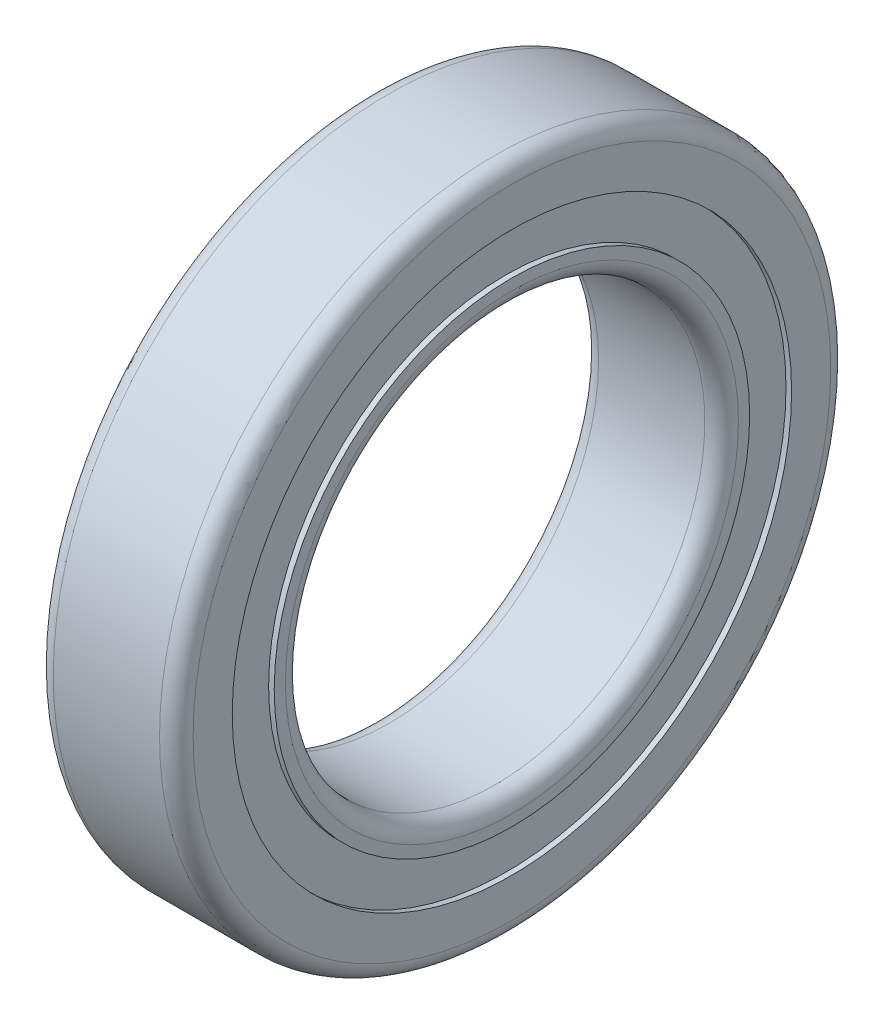
ISO-10303-21;
HEADER;
FILE_DESCRIPTION(('STEP AP214'),'2;1');
FILE_NAME('part.step','',(''),(''),'','','');
FILE_SCHEMA(('AUTOMOTIVE_DESIGN { 1 0 10303 214 1 1 1 1 }'));
ENDSEC;
DATA;
#1=APPLICATION_CONTEXT('core data for automotive mechanical design processes');
#2=APPLICATION_PROTOCOL_DEFINITION('international standard','automotive_design',2000,#1);
#3=PRODUCT_CONTEXT('',#1,'mechanical');
#4=PRODUCT('Part','Part','',(#3));
#5=PRODUCT_RELATED_PRODUCT_CATEGORY('part','',(#4));
#6=PRODUCT_DEFINITION_FORMATION('','',#4);
#7=PRODUCT_DEFINITION_CONTEXT('part definition',#1,'design');
#8=PRODUCT_DEFINITION('design','',#6,#7);
#9=PRODUCT_DEFINITION_SHAPE('','',#8);
#10=(LENGTH_UNIT() NAMED_UNIT(*) SI_UNIT(.MILLI.,.METRE.));
#11=(NAMED_UNIT(*) PLANE_ANGLE_UNIT() SI_UNIT($,.RADIAN.));
#12=(NAMED_UNIT(*) SI_UNIT($,.STERADIAN.) SOLID_ANGLE_UNIT());
#13=UNCERTAINTY_MEASURE_WITH_UNIT(LENGTH_MEASURE(1.E-05),#10,'distance_accuracy_value','');
#14=(GEOMETRIC_REPRESENTATION_CONTEXT(3) GLOBAL_UNCERTAINTY_ASSIGNED_CONTEXT((#13)) GLOBAL_UNIT_ASSIGNED_CONTEXT((#10,
#11,#12)) REPRESENTATION_CONTEXT('',''));
#15=CARTESIAN_POINT('',(0.,0.,0.));
#16=DIRECTION('',(0.,0.,1.));
#17=DIRECTION('',(1.,0.,0.));
#18=AXIS2_PLACEMENT_3D('',#15,#16,#17);
#19=CARTESIAN_POINT('',(0.,0.,0.));
#20=DIRECTION('',(-1.,0.,0.));
#21=DIRECTION('',(0.,0.,1.));
#22=AXIS2_PLACEMENT_3D('',#19,#20,#21);
#23=CYLINDRICAL_SURFACE('',#22,8.5);
#24=CARTESIAN_POINT('',(0.,0.,0.));
#25=DIRECTION('',(-1.,0.,0.));
#26=DIRECTION('',(0.,0.,1.));
#27=AXIS2_PLACEMENT_3D('',#24,#25,#26);
#28=CIRCLE('',#27,8.5);
#29=CARTESIAN_POINT('',(0.,0.,8.5));
#30=VERTEX_POINT('',#29);
#31=EDGE_CURVE('E63',#30,#30,#28,.T.);
#32=ORIENTED_EDGE('',*,*,#31,.F.);
#33=EDGE_LOOP('',(#32));
#34=FACE_BOUND('',#33,.T.);
#35=CARTESIAN_POINT('',(0.200000000000001,0.,0.));
#36=DIRECTION('',(-1.,0.,0.));
#37=DIRECTION('',(0.,0.,1.));
#38=AXIS2_PLACEMENT_3D('',#35,#36,#37);
#39=CIRCLE('',#38,8.5);
#40=CARTESIAN_POINT('',(0.200000000000001,0.,8.5));
#41=VERTEX_POINT('',#40);
#42=EDGE_CURVE('E84',#41,#41,#39,.T.);
#43=ORIENTED_EDGE('',*,*,#42,.T.);
#44=EDGE_LOOP('',(#43));
#45=FACE_BOUND('',#44,.T.);
#46=ADVANCED_FACE('F31',(#34,#45),#23,.T.);
#47=CARTESIAN_POINT('',(0.,8.5,0.));
#48=DIRECTION('',(1.,0.,0.));
#49=DIRECTION('',(0.,0.,-1.));
#50=AXIS2_PLACEMENT_3D('',#47,#48,#49);
#51=PLANE('',#50);
#52=CARTESIAN_POINT('',(0.,0.,0.));
#53=DIRECTION('',(1.,0.,0.));
#54=DIRECTION('',(0.,0.,-1.));
#55=AXIS2_PLACEMENT_3D('',#52,#53,#54);
#56=CIRCLE('',#55,8.1);
#57=CARTESIAN_POINT('',(0.,0.,-8.1));
#58=VERTEX_POINT('',#57);
#59=EDGE_CURVE('E54',#58,#58,#56,.T.);
#60=ORIENTED_EDGE('',*,*,#59,.T.);
#61=EDGE_LOOP('',(#60));
#62=FACE_BOUND('',#61,.T.);
#63=ORIENTED_EDGE('',*,*,#31,.T.);
#64=EDGE_LOOP('',(#63));
#65=FACE_BOUND('',#64,.T.);
#66=ADVANCED_FACE('F113',(#62,#65),#51,.F.);
#67=CARTESIAN_POINT('',(0.,0.,0.));
#68=DIRECTION('',(-1.,0.,0.));
#69=DIRECTION('',(0.,0.,1.));
#70=AXIS2_PLACEMENT_3D('',#67,#68,#69);
#71=CYLINDRICAL_SURFACE('',#70,7.5);
#72=CARTESIAN_POINT('',(0.6,0.,0.));
#73=DIRECTION('',(1.,0.,0.));
#74=DIRECTION('',(0.,0.,-1.));
#75=AXIS2_PLACEMENT_3D('',#72,#73,#74);
#76=CIRCLE('',#75,7.5);
#77=CARTESIAN_POINT('',(0.6,0.,-7.5));
#78=VERTEX_POINT('',#77);
#79=EDGE_CURVE('E57',#78,#78,#76,.F.);
#80=ORIENTED_EDGE('',*,*,#79,.T.);
#81=EDGE_LOOP('',(#80));
#82=FACE_BOUND('',#81,.T.);
#83=CARTESIAN_POINT('',(4.4,0.,0.));
#84=DIRECTION('',(-1.,0.,0.));
#85=DIRECTION('',(0.,0.,1.));
#86=AXIS2_PLACEMENT_3D('',#83,#84,#85);
#87=CIRCLE('',#86,7.5);
#88=CARTESIAN_POINT('',(4.4,0.,7.5));
#89=VERTEX_POINT('',#88);
#90=EDGE_CURVE('E60',#89,#89,#87,.F.);
#91=ORIENTED_EDGE('',*,*,#90,.T.);
#92=EDGE_LOOP('',(#91));
#93=FACE_BOUND('',#92,.T.);
#94=ADVANCED_FACE('F119',(#82,#93),#71,.F.);
#95=CARTESIAN_POINT('',(5.,7.5,0.));
#96=DIRECTION('',(-1.,0.,0.));
#97=DIRECTION('',(0.,0.,1.));
#98=AXIS2_PLACEMENT_3D('',#95,#96,#97);
#99=PLANE('',#98);
#100=CARTESIAN_POINT('',(5.,0.,0.));
#101=DIRECTION('',(-1.,0.,0.));
#102=DIRECTION('',(0.,0.,1.));
#103=AXIS2_PLACEMENT_3D('',#100,#101,#102);
#104=CIRCLE('',#103,8.1);
#105=CARTESIAN_POINT('',(5.,0.,8.1));
#106=VERTEX_POINT('',#105);
#107=EDGE_CURVE('E51',#106,#106,#104,.T.);
#108=ORIENTED_EDGE('',*,*,#107,.T.);
#109=EDGE_LOOP('',(#108));
#110=FACE_BOUND('',#109,.T.);
#111=CARTESIAN_POINT('',(5.,0.,0.));
#112=DIRECTION('',(-1.,0.,0.));
#113=DIRECTION('',(0.,0.,1.));
#114=AXIS2_PLACEMENT_3D('',#111,#112,#113);
#115=CIRCLE('',#114,8.5);
#116=CARTESIAN_POINT('',(5.,0.,8.5));
#117=VERTEX_POINT('',#116);
#118=EDGE_CURVE('E66',#117,#117,#115,.T.);
#119=ORIENTED_EDGE('',*,*,#118,.F.);
#120=EDGE_LOOP('',(#119));
#121=FACE_BOUND('',#120,.T.);
#122=ADVANCED_FACE('F189',(#110,#121),#99,.F.);
#123=CARTESIAN_POINT('',(0.,0.,0.));
#124=DIRECTION('',(-1.,0.,0.));
#125=DIRECTION('',(0.,0.,1.));
#126=AXIS2_PLACEMENT_3D('',#123,#124,#125);
#127=CYLINDRICAL_SURFACE('',#126,8.5);
#128=CARTESIAN_POINT('',(4.8,0.,0.));
#129=DIRECTION('',(-1.,0.,0.));
#130=DIRECTION('',(0.,0.,1.));
#131=AXIS2_PLACEMENT_3D('',#128,#129,#130);
#132=CIRCLE('',#131,8.5);
#133=CARTESIAN_POINT('',(4.8,0.,8.5));
#134=VERTEX_POINT('',#133);
#135=EDGE_CURVE('E69',#134,#134,#132,.T.);
#136=ORIENTED_EDGE('',*,*,#135,.F.);
#137=EDGE_LOOP('',(#136));
#138=FACE_BOUND('',#137,.T.);
#139=ORIENTED_EDGE('',*,*,#118,.T.);
#140=EDGE_LOOP('',(#139));
#141=FACE_BOUND('',#140,.T.);
#142=ADVANCED_FACE('F194',(#138,#141),#127,.T.);
#143=CARTESIAN_POINT('',(4.8,8.5,0.));
#144=DIRECTION('',(-1.,0.,0.));
#145=DIRECTION('',(0.,0.,1.));
#146=AXIS2_PLACEMENT_3D('',#143,#144,#145);
#147=PLANE('',#146);
#148=CARTESIAN_POINT('',(4.8,0.,0.));
#149=DIRECTION('',(-1.,0.,0.));
#150=DIRECTION('',(0.,0.,1.));
#151=AXIS2_PLACEMENT_3D('',#148,#149,#150);
#152=CIRCLE('',#151,10.);
#153=CARTESIAN_POINT('',(4.8,0.,10.));
#154=VERTEX_POINT('',#153);
#155=EDGE_CURVE('E72',#154,#154,#152,.T.);
#156=ORIENTED_EDGE('',*,*,#155,.F.);
#157=EDGE_LOOP('',(#156));
#158=FACE_BOUND('',#157,.T.);
#159=ORIENTED_EDGE('',*,*,#135,.T.);
#160=EDGE_LOOP('',(#159));
#161=FACE_BOUND('',#160,.T.);
#162=ADVANCED_FACE('F229',(#158,#161),#147,.F.);
#163=CARTESIAN_POINT('',(0.,0.,0.));
#164=DIRECTION('',(-1.,0.,0.));
#165=DIRECTION('',(0.,0.,1.));
#166=AXIS2_PLACEMENT_3D('',#163,#164,#165);
#167=CYLINDRICAL_SURFACE('',#166,10.);
#168=CARTESIAN_POINT('',(5.,0.,0.));
#169=DIRECTION('',(-1.,0.,0.));
#170=DIRECTION('',(0.,0.,1.));
#171=AXIS2_PLACEMENT_3D('',#168,#169,#170);
#172=CIRCLE('',#171,10.);
#173=CARTESIAN_POINT('',(5.,0.,10.));
#174=VERTEX_POINT('',#173);
#175=EDGE_CURVE('E75',#174,#174,#172,.T.);
#176=ORIENTED_EDGE('',*,*,#175,.F.);
#177=EDGE_LOOP('',(#176));
#178=FACE_BOUND('',#177,.T.);
#179=ORIENTED_EDGE('',*,*,#155,.T.);
#180=EDGE_LOOP('',(#179));
#181=FACE_BOUND('',#180,.T.);
#182=ADVANCED_FACE('F182',(#178,#181),#167,.F.);
#183=CARTESIAN_POINT('',(5.,10.,0.));
#184=DIRECTION('',(-1.,0.,0.));
#185=DIRECTION('',(0.,0.,1.));
#186=AXIS2_PLACEMENT_3D('',#183,#184,#185);
#187=PLANE('',#186);
#188=CARTESIAN_POINT('',(5.,0.,0.));
#189=DIRECTION('',(-1.,0.,0.));
#190=DIRECTION('',(0.,0.,1.));
#191=AXIS2_PLACEMENT_3D('',#188,#189,#190);
#192=CIRCLE('',#191,11.4);
#193=CARTESIAN_POINT('',(5.,0.,11.4));
#194=VERTEX_POINT('',#193);
#195=EDGE_CURVE('E38',#194,#194,#192,.F.);
#196=ORIENTED_EDGE('',*,*,#195,.T.);
#197=EDGE_LOOP('',(#196));
#198=FACE_BOUND('',#197,.T.);
#199=ORIENTED_EDGE('',*,*,#175,.T.);
#200=EDGE_LOOP('',(#199));
#201=FACE_BOUND('',#200,.T.);
#202=ADVANCED_FACE('F109',(#198,#201),#187,.F.);
#203=CARTESIAN_POINT('',(0.,0.,0.));
#204=DIRECTION('',(-1.,0.,0.));
#205=DIRECTION('',(0.,0.,1.));
#206=AXIS2_PLACEMENT_3D('',#203,#204,#205);
#207=CYLINDRICAL_SURFACE('',#206,12.);
#208=CARTESIAN_POINT('',(4.4,0.,0.));
#209=DIRECTION('',(-1.,0.,0.));
#210=DIRECTION('',(0.,0.,1.));
#211=AXIS2_PLACEMENT_3D('',#208,#209,#210);
#212=CIRCLE('',#211,12.);
#213=CARTESIAN_POINT('',(4.4,0.,12.));
#214=VERTEX_POINT('',#213);
#215=EDGE_CURVE('E42',#214,#214,#212,.T.);
#216=ORIENTED_EDGE('',*,*,#215,.T.);
#217=EDGE_LOOP('',(#216));
#218=FACE_BOUND('',#217,.T.);
#219=CARTESIAN_POINT('',(0.6,0.,0.));
#220=DIRECTION('',(1.,0.,0.));
#221=DIRECTION('',(0.,0.,-1.));
#222=AXIS2_PLACEMENT_3D('',#219,#220,#221);
#223=CIRCLE('',#222,12.);
#224=CARTESIAN_POINT('',(0.6,0.,-12.));
#225=VERTEX_POINT('',#224);
#226=EDGE_CURVE('E46',#225,#225,#223,.T.);
#227=ORIENTED_EDGE('',*,*,#226,.T.);
#228=EDGE_LOOP('',(#227));
#229=FACE_BOUND('',#228,.T.);
#230=ADVANCED_FACE('F104',(#218,#229),#207,.T.);
#231=CARTESIAN_POINT('',(0.,12.,0.));
#232=DIRECTION('',(1.,0.,0.));
#233=DIRECTION('',(0.,0.,-1.));
#234=AXIS2_PLACEMENT_3D('',#231,#232,#233);
#235=PLANE('',#234);
#236=CARTESIAN_POINT('',(0.,0.,0.));
#237=DIRECTION('',(1.,0.,0.));
#238=DIRECTION('',(0.,0.,-1.));
#239=AXIS2_PLACEMENT_3D('',#236,#237,#238);
#240=CIRCLE('',#239,11.4);
#241=CARTESIAN_POINT('',(0.,0.,-11.4));
#242=VERTEX_POINT('',#241);
#243=EDGE_CURVE('E10',#242,#242,#240,.F.);
#244=ORIENTED_EDGE('',*,*,#243,.T.);
#245=EDGE_LOOP('',(#244));
#246=FACE_BOUND('',#245,.T.);
#247=CARTESIAN_POINT('',(0.,0.,0.));
#248=DIRECTION('',(-1.,0.,0.));
#249=DIRECTION('',(0.,0.,1.));
#250=AXIS2_PLACEMENT_3D('',#247,#248,#249);
#251=CIRCLE('',#250,10.);
#252=CARTESIAN_POINT('',(0.,0.,10.));
#253=VERTEX_POINT('',#252);
#254=EDGE_CURVE('E78',#253,#253,#251,.T.);
#255=ORIENTED_EDGE('',*,*,#254,.F.);
#256=EDGE_LOOP('',(#255));
#257=FACE_BOUND('',#256,.T.);
#258=ADVANCED_FACE('F99',(#246,#257),#235,.F.);
#259=CARTESIAN_POINT('',(0.,0.,0.));
#260=DIRECTION('',(-1.,0.,0.));
#261=DIRECTION('',(0.,0.,1.));
#262=AXIS2_PLACEMENT_3D('',#259,#260,#261);
#263=CYLINDRICAL_SURFACE('',#262,10.);
#264=CARTESIAN_POINT('',(0.200000000000001,0.,0.));
#265=DIRECTION('',(-1.,0.,0.));
#266=DIRECTION('',(0.,0.,1.));
#267=AXIS2_PLACEMENT_3D('',#264,#265,#266);
#268=CIRCLE('',#267,10.);
#269=CARTESIAN_POINT('',(0.200000000000001,0.,10.));
#270=VERTEX_POINT('',#269);
#271=EDGE_CURVE('E81',#270,#270,#268,.T.);
#272=ORIENTED_EDGE('',*,*,#271,.F.);
#273=EDGE_LOOP('',(#272));
#274=FACE_BOUND('',#273,.T.);
#275=ORIENTED_EDGE('',*,*,#254,.T.);
#276=EDGE_LOOP('',(#275));
#277=FACE_BOUND('',#276,.T.);
#278=ADVANCED_FACE('F93',(#274,#277),#263,.F.);
#279=CARTESIAN_POINT('',(0.200000000000001,10.,0.));
#280=DIRECTION('',(1.,0.,0.));
#281=DIRECTION('',(0.,0.,-1.));
#282=AXIS2_PLACEMENT_3D('',#279,#280,#281);
#283=PLANE('',#282);
#284=ORIENTED_EDGE('',*,*,#42,.F.);
#285=EDGE_LOOP('',(#284));
#286=FACE_BOUND('',#285,.T.);
#287=ORIENTED_EDGE('',*,*,#271,.T.);
#288=EDGE_LOOP('',(#287));
#289=FACE_BOUND('',#288,.T.);
#290=ADVANCED_FACE('F89',(#286,#289),#283,.F.);
#291=CARTESIAN_POINT('',(0.6,0.,0.));
#292=DIRECTION('',(1.,0.,0.));
#293=DIRECTION('',(0.,0.,-1.));
#294=AXIS2_PLACEMENT_3D('',#291,#292,#293);
#295=TOROIDAL_SURFACE('',#294,8.1,0.6);
#296=ORIENTED_EDGE('',*,*,#59,.F.);
#297=EDGE_LOOP('',(#296));
#298=FACE_BOUND('',#297,.T.);
#299=ORIENTED_EDGE('',*,*,#79,.F.);
#300=EDGE_LOOP('',(#299));
#301=FACE_BOUND('',#300,.T.);
#302=ADVANCED_FACE('F92',(#298,#301),#295,.T.);
#303=CARTESIAN_POINT('',(4.4,0.,0.));
#304=DIRECTION('',(-1.,0.,0.));
#305=DIRECTION('',(0.,0.,1.));
#306=AXIS2_PLACEMENT_3D('',#303,#304,#305);
#307=TOROIDAL_SURFACE('',#306,8.1,0.6);
#308=ORIENTED_EDGE('',*,*,#90,.F.);
#309=EDGE_LOOP('',(#308));
#310=FACE_BOUND('',#309,.T.);
#311=ORIENTED_EDGE('',*,*,#107,.F.);
#312=EDGE_LOOP('',(#311));
#313=FACE_BOUND('',#312,.T.);
#314=ADVANCED_FACE('F127',(#310,#313),#307,.T.);
#315=CARTESIAN_POINT('',(4.4,0.,0.));
#316=DIRECTION('',(-1.,0.,0.));
#317=DIRECTION('',(0.,0.,1.));
#318=AXIS2_PLACEMENT_3D('',#315,#316,#317);
#319=TOROIDAL_SURFACE('',#318,11.4,0.6);
#320=ORIENTED_EDGE('',*,*,#195,.F.);
#321=EDGE_LOOP('',(#320));
#322=FACE_BOUND('',#321,.T.);
#323=ORIENTED_EDGE('',*,*,#215,.F.);
#324=EDGE_LOOP('',(#323));
#325=FACE_BOUND('',#324,.T.);
#326=ADVANCED_FACE('F130',(#322,#325),#319,.T.);
#327=CARTESIAN_POINT('',(0.6,0.,0.));
#328=DIRECTION('',(1.,0.,0.));
#329=DIRECTION('',(0.,0.,-1.));
#330=AXIS2_PLACEMENT_3D('',#327,#328,#329);
#331=TOROIDAL_SURFACE('',#330,11.4,0.6);
#332=ORIENTED_EDGE('',*,*,#226,.F.);
#333=EDGE_LOOP('',(#332));
#334=FACE_BOUND('',#333,.T.);
#335=ORIENTED_EDGE('',*,*,#243,.F.);
#336=EDGE_LOOP('',(#335));
#337=FACE_BOUND('',#336,.T.);
#338=ADVANCED_FACE('F33',(#334,#337),#331,.T.);
#339=CLOSED_SHELL('',(#46,#66,#94,#122,#142,#162,#182,#202,#230,#258,#278,#290,#302,#314,#326,#338));
#340=MANIFOLD_SOLID_BREP('B2',#339);
#341=ADVANCED_BREP_SHAPE_REPRESENTATION('',(#18,#340),#14);
#342=SHAPE_DEFINITION_REPRESENTATION(#9,#341);
ENDSEC;
END-ISO-10303-21;
